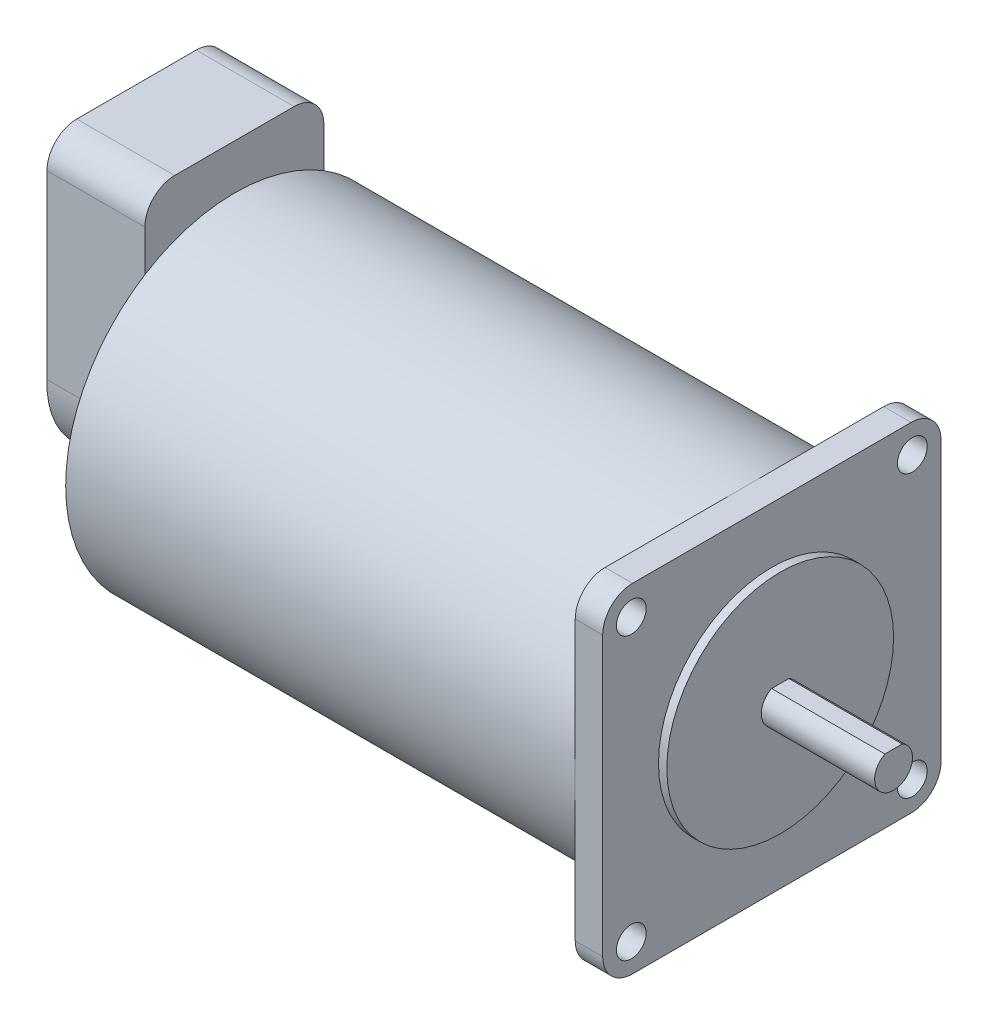
ISO-10303-21;
HEADER;
FILE_DESCRIPTION(('STEP AP214'),'2;1');
FILE_NAME('part.step','',(''),(''),'','','');
FILE_SCHEMA(('AUTOMOTIVE_DESIGN { 1 0 10303 214 1 1 1 1 }'));
ENDSEC;
DATA;
#1=APPLICATION_CONTEXT('core data for automotive mechanical design processes');
#2=APPLICATION_PROTOCOL_DEFINITION('international standard','automotive_design',2000,#1);
#3=PRODUCT_CONTEXT('',#1,'mechanical');
#4=PRODUCT('Part','Part','',(#3));
#5=PRODUCT_RELATED_PRODUCT_CATEGORY('part','',(#4));
#6=PRODUCT_DEFINITION_FORMATION('','',#4);
#7=PRODUCT_DEFINITION_CONTEXT('part definition',#1,'design');
#8=PRODUCT_DEFINITION('design','',#6,#7);
#9=PRODUCT_DEFINITION_SHAPE('','',#8);
#10=(LENGTH_UNIT() NAMED_UNIT(*) SI_UNIT(.MILLI.,.METRE.));
#11=(NAMED_UNIT(*) PLANE_ANGLE_UNIT() SI_UNIT($,.RADIAN.));
#12=(NAMED_UNIT(*) SI_UNIT($,.STERADIAN.) SOLID_ANGLE_UNIT());
#13=UNCERTAINTY_MEASURE_WITH_UNIT(LENGTH_MEASURE(1.E-05),#10,'distance_accuracy_value','');
#14=(GEOMETRIC_REPRESENTATION_CONTEXT(3) GLOBAL_UNCERTAINTY_ASSIGNED_CONTEXT((#13)) GLOBAL_UNIT_ASSIGNED_CONTEXT((#10,
#11,#12)) REPRESENTATION_CONTEXT('',''));
#15=CARTESIAN_POINT('',(0.,0.,0.));
#16=DIRECTION('',(0.,0.,1.));
#17=DIRECTION('',(1.,0.,0.));
#18=AXIS2_PLACEMENT_3D('',#15,#16,#17);
#19=CARTESIAN_POINT('',(0.,0.,0.));
#20=DIRECTION('',(1.,0.,0.));
#21=DIRECTION('',(0.,0.,-1.));
#22=AXIS2_PLACEMENT_3D('',#19,#20,#21);
#23=PLANE('',#22);
#24=DIRECTION('',(0.,-1.,0.));
#25=VECTOR('',#24,1.);
#26=CARTESIAN_POINT('',(0.,-2.26844785788964,-14.9198348553773));
#27=LINE('',#26,#25);
#28=CARTESIAN_POINT('',(0.,24.1064519970955,-14.9198348553773));
#29=VERTEX_POINT('',#28);
#30=CARTESIAN_POINT('',(0.,-2.26844785788964,-14.9198348553773));
#31=VERTEX_POINT('',#30);
#32=EDGE_CURVE('E11',#29,#31,#27,.T.);
#33=ORIENTED_EDGE('',*,*,#32,.F.);
#34=CARTESIAN_POINT('',(0.,0.,0.));
#35=DIRECTION('',(1.,0.,0.));
#36=DIRECTION('',(0.,0.,-1.));
#37=AXIS2_PLACEMENT_3D('',#34,#35,#36);
#38=CIRCLE('',#37,28.35);
#39=CARTESIAN_POINT('',(0.,24.0064807752179,15.0801651446227));
#40=VERTEX_POINT('',#39);
#41=EDGE_CURVE('E250',#40,#29,#38,.T.);
#42=ORIENTED_EDGE('',*,*,#41,.F.);
#43=DIRECTION('',(0.,1.,0.));
#44=VECTOR('',#43,1.);
#45=CARTESIAN_POINT('',(0.,0.579609356899091,15.0801651446227));
#46=LINE('',#45,#44);
#47=CARTESIAN_POINT('',(0.,0.579609356899091,15.0801651446227));
#48=VERTEX_POINT('',#47);
#49=EDGE_CURVE('E55',#48,#40,#46,.T.);
#50=ORIENTED_EDGE('',*,*,#49,.F.);
#51=CARTESIAN_POINT('',(0.,0.,0.));
#52=DIRECTION('',(-1.,0.,0.));
#53=DIRECTION('',(0.,0.,1.));
#54=AXIS2_PLACEMENT_3D('',#51,#52,#53);
#55=CIRCLE('',#54,15.0912997384485);
#56=EDGE_CURVE('E51',#31,#48,#55,.T.);
#57=ORIENTED_EDGE('',*,*,#56,.F.);
#58=EDGE_LOOP('',(#33,#42,#50,#57));
#59=FACE_BOUND('',#58,.T.);
#60=ADVANCED_FACE('F34',(#59),#23,.F.);
#61=CARTESIAN_POINT('',(91.4,0.,0.));
#62=DIRECTION('',(1.,0.,0.));
#63=DIRECTION('',(0.,0.,-1.));
#64=AXIS2_PLACEMENT_3D('',#61,#62,#63);
#65=PLANE('',#64);
#66=CARTESIAN_POINT('',(91.4,0.,0.));
#67=DIRECTION('',(1.,0.,0.));
#68=DIRECTION('',(0.,0.,-1.));
#69=AXIS2_PLACEMENT_3D('',#66,#67,#68);
#70=CIRCLE('',#69,19.);
#71=CARTESIAN_POINT('',(91.4,0.,-19.));
#72=VERTEX_POINT('',#71);
#73=EDGE_CURVE('E207',#72,#72,#70,.T.);
#74=ORIENTED_EDGE('',*,*,#73,.T.);
#75=EDGE_LOOP('',(#74));
#76=FACE_BOUND('',#75,.T.);
#77=DIRECTION('',(0.,0.,1.));
#78=VECTOR('',#77,1.);
#79=CARTESIAN_POINT('',(91.4,2.825,1.44913767461894));
#80=LINE('',#79,#78);
#81=CARTESIAN_POINT('',(91.4,2.825,-1.44913767461894));
#82=VERTEX_POINT('',#81);
#83=CARTESIAN_POINT('',(91.4,2.825,1.44913767461894));
#84=VERTEX_POINT('',#83);
#85=EDGE_CURVE('E188',#82,#84,#80,.T.);
#86=ORIENTED_EDGE('',*,*,#85,.F.);
#87=CARTESIAN_POINT('',(91.4,0.,0.));
#88=DIRECTION('',(1.,0.,0.));
#89=DIRECTION('',(0.,0.,1.));
#90=AXIS2_PLACEMENT_3D('',#87,#88,#89);
#91=CIRCLE('',#90,3.175);
#92=EDGE_CURVE('E186',#84,#82,#91,.T.);
#93=ORIENTED_EDGE('',*,*,#92,.F.);
#94=EDGE_LOOP('',(#86,#93));
#95=FACE_BOUND('',#94,.T.);
#96=ADVANCED_FACE('F374',(#76,#95),#65,.T.);
#97=CARTESIAN_POINT('',(85.4,0.,0.));
#98=DIRECTION('',(-1.,0.,0.));
#99=DIRECTION('',(0.,0.,1.));
#100=AXIS2_PLACEMENT_3D('',#97,#98,#99);
#101=CYLINDRICAL_SURFACE('',#100,28.35);
#102=CARTESIAN_POINT('',(85.4,0.,0.));
#103=DIRECTION('',(1.,0.,0.));
#104=DIRECTION('',(0.,0.,-1.));
#105=AXIS2_PLACEMENT_3D('',#102,#103,#104);
#106=CIRCLE('',#105,28.35);
#107=CARTESIAN_POINT('',(85.4,0.,-28.35));
#108=VERTEX_POINT('',#107);
#109=CARTESIAN_POINT('',(85.4,28.35,0.));
#110=VERTEX_POINT('',#109);
#111=EDGE_CURVE('E261',#108,#110,#106,.T.);
#112=ORIENTED_EDGE('',*,*,#111,.F.);
#113=CARTESIAN_POINT('',(85.4,-28.35,0.));
#114=VERTEX_POINT('',#113);
#115=EDGE_CURVE('E266',#114,#108,#106,.T.);
#116=ORIENTED_EDGE('',*,*,#115,.F.);
#117=CARTESIAN_POINT('',(85.4,0.,28.35));
#118=VERTEX_POINT('',#117);
#119=EDGE_CURVE('E329',#118,#114,#106,.T.);
#120=ORIENTED_EDGE('',*,*,#119,.F.);
#121=EDGE_CURVE('E265',#110,#118,#106,.T.);
#122=ORIENTED_EDGE('',*,*,#121,.F.);
#123=EDGE_LOOP('',(#112,#116,#120,#122));
#124=FACE_BOUND('',#123,.T.);
#125=EDGE_CURVE('E267',#29,#40,#38,.T.);
#126=ORIENTED_EDGE('',*,*,#125,.T.);
#127=ORIENTED_EDGE('',*,*,#41,.T.);
#128=EDGE_LOOP('',(#126,#127));
#129=FACE_BOUND('',#128,.T.);
#130=ADVANCED_FACE('F331',(#124,#129),#101,.T.);
#131=CARTESIAN_POINT('',(85.4,0.,0.));
#132=DIRECTION('',(1.,0.,0.));
#133=DIRECTION('',(0.,0.,-1.));
#134=AXIS2_PLACEMENT_3D('',#131,#132,#133);
#135=PLANE('',#134);
#136=CARTESIAN_POINT('',(85.4,23.55,-23.55));
#137=DIRECTION('',(1.,0.,0.));
#138=DIRECTION('',(0.,0.,-1.));
#139=AXIS2_PLACEMENT_3D('',#136,#137,#138);
#140=CIRCLE('',#139,2.5);
#141=CARTESIAN_POINT('',(85.4,23.55,-26.05));
#142=VERTEX_POINT('',#141);
#143=EDGE_CURVE('E222',#142,#142,#140,.T.);
#144=ORIENTED_EDGE('',*,*,#143,.T.);
#145=EDGE_LOOP('',(#144));
#146=FACE_BOUND('',#145,.T.);
#147=DIRECTION('',(0.,0.,1.));
#148=VECTOR('',#147,1.);
#149=CARTESIAN_POINT('',(85.4,28.35,28.35));
#150=LINE('',#149,#148);
#151=CARTESIAN_POINT('',(85.4,28.35,-23.35));
#152=VERTEX_POINT('',#151);
#153=EDGE_CURVE('E241',#152,#110,#150,.T.);
#154=ORIENTED_EDGE('',*,*,#153,.F.);
#155=CARTESIAN_POINT('',(85.4,23.35,-23.35));
#156=DIRECTION('',(1.,0.,0.));
#157=DIRECTION('',(0.,0.,-1.));
#158=AXIS2_PLACEMENT_3D('',#155,#156,#157);
#159=CIRCLE('',#158,5.);
#160=CARTESIAN_POINT('',(85.4,23.35,-28.35));
#161=VERTEX_POINT('',#160);
#162=EDGE_CURVE('E293',#152,#161,#159,.F.);
#163=ORIENTED_EDGE('',*,*,#162,.T.);
#164=DIRECTION('',(0.,1.,0.));
#165=VECTOR('',#164,1.);
#166=CARTESIAN_POINT('',(85.4,28.35,-28.35));
#167=LINE('',#166,#165);
#168=EDGE_CURVE('E256',#108,#161,#167,.T.);
#169=ORIENTED_EDGE('',*,*,#168,.F.);
#170=ORIENTED_EDGE('',*,*,#111,.T.);
#171=EDGE_LOOP('',(#154,#163,#169,#170));
#172=FACE_BOUND('',#171,.T.);
#173=ADVANCED_FACE('F359',(#146,#172),#135,.F.);
#174=CARTESIAN_POINT('',(85.4,23.55,23.55));
#175=DIRECTION('',(1.,0.,0.));
#176=DIRECTION('',(0.,0.,-1.));
#177=AXIS2_PLACEMENT_3D('',#174,#175,#176);
#178=CIRCLE('',#177,2.5);
#179=CARTESIAN_POINT('',(85.4,23.55,21.05));
#180=VERTEX_POINT('',#179);
#181=EDGE_CURVE('E228',#180,#180,#178,.T.);
#182=ORIENTED_EDGE('',*,*,#181,.T.);
#183=EDGE_LOOP('',(#182));
#184=FACE_BOUND('',#183,.T.);
#185=DIRECTION('',(0.,-1.,0.));
#186=VECTOR('',#185,1.);
#187=CARTESIAN_POINT('',(85.4,28.35,28.35));
#188=LINE('',#187,#186);
#189=CARTESIAN_POINT('',(85.4,23.35,28.35));
#190=VERTEX_POINT('',#189);
#191=EDGE_CURVE('E251',#190,#118,#188,.T.);
#192=ORIENTED_EDGE('',*,*,#191,.F.);
#193=CARTESIAN_POINT('',(85.4,23.35,23.35));
#194=DIRECTION('',(1.,0.,0.));
#195=DIRECTION('',(0.,0.,-1.));
#196=AXIS2_PLACEMENT_3D('',#193,#194,#195);
#197=CIRCLE('',#196,5.);
#198=CARTESIAN_POINT('',(85.4,28.35,23.35));
#199=VERTEX_POINT('',#198);
#200=EDGE_CURVE('E38',#190,#199,#197,.F.);
#201=ORIENTED_EDGE('',*,*,#200,.T.);
#202=EDGE_CURVE('E259',#110,#199,#150,.T.);
#203=ORIENTED_EDGE('',*,*,#202,.F.);
#204=ORIENTED_EDGE('',*,*,#121,.T.);
#205=EDGE_LOOP('',(#192,#201,#203,#204));
#206=FACE_BOUND('',#205,.T.);
#207=ADVANCED_FACE('F308',(#184,#206),#135,.F.);
#208=CARTESIAN_POINT('',(85.4,-23.55,23.55));
#209=DIRECTION('',(1.,0.,0.));
#210=DIRECTION('',(0.,0.,-1.));
#211=AXIS2_PLACEMENT_3D('',#208,#209,#210);
#212=CIRCLE('',#211,2.5);
#213=CARTESIAN_POINT('',(85.4,-23.55,21.05));
#214=VERTEX_POINT('',#213);
#215=EDGE_CURVE('E210',#214,#214,#212,.T.);
#216=ORIENTED_EDGE('',*,*,#215,.T.);
#217=EDGE_LOOP('',(#216));
#218=FACE_BOUND('',#217,.T.);
#219=DIRECTION('',(0.,0.,-1.));
#220=VECTOR('',#219,1.);
#221=CARTESIAN_POINT('',(85.4,-28.35,28.35));
#222=LINE('',#221,#220);
#223=CARTESIAN_POINT('',(85.4,-28.35,23.35));
#224=VERTEX_POINT('',#223);
#225=EDGE_CURVE('E254',#224,#114,#222,.T.);
#226=ORIENTED_EDGE('',*,*,#225,.F.);
#227=CARTESIAN_POINT('',(85.4,-23.35,23.35));
#228=DIRECTION('',(1.,0.,0.));
#229=DIRECTION('',(0.,0.,-1.));
#230=AXIS2_PLACEMENT_3D('',#227,#228,#229);
#231=CIRCLE('',#230,5.);
#232=CARTESIAN_POINT('',(85.4,-23.35,28.35));
#233=VERTEX_POINT('',#232);
#234=EDGE_CURVE('E295',#224,#233,#231,.F.);
#235=ORIENTED_EDGE('',*,*,#234,.T.);
#236=EDGE_CURVE('E234',#118,#233,#188,.T.);
#237=ORIENTED_EDGE('',*,*,#236,.F.);
#238=ORIENTED_EDGE('',*,*,#119,.T.);
#239=EDGE_LOOP('',(#226,#235,#237,#238));
#240=FACE_BOUND('',#239,.T.);
#241=ADVANCED_FACE('F337',(#218,#240),#135,.F.);
#242=CARTESIAN_POINT('',(85.4,-23.55,-23.55));
#243=DIRECTION('',(1.,0.,0.));
#244=DIRECTION('',(0.,0.,-1.));
#245=AXIS2_PLACEMENT_3D('',#242,#243,#244);
#246=CIRCLE('',#245,2.5);
#247=CARTESIAN_POINT('',(85.4,-23.55,-26.05));
#248=VERTEX_POINT('',#247);
#249=EDGE_CURVE('E216',#248,#248,#246,.T.);
#250=ORIENTED_EDGE('',*,*,#249,.T.);
#251=EDGE_LOOP('',(#250));
#252=FACE_BOUND('',#251,.T.);
#253=CARTESIAN_POINT('',(85.4,-23.35,-28.35));
#254=VERTEX_POINT('',#253);
#255=EDGE_CURVE('E257',#254,#108,#167,.T.);
#256=ORIENTED_EDGE('',*,*,#255,.F.);
#257=CARTESIAN_POINT('',(85.4,-23.35,-23.35));
#258=DIRECTION('',(1.,0.,0.));
#259=DIRECTION('',(0.,0.,-1.));
#260=AXIS2_PLACEMENT_3D('',#257,#258,#259);
#261=CIRCLE('',#260,5.);
#262=CARTESIAN_POINT('',(85.4,-28.35,-23.35));
#263=VERTEX_POINT('',#262);
#264=EDGE_CURVE('E273',#254,#263,#261,.F.);
#265=ORIENTED_EDGE('',*,*,#264,.T.);
#266=EDGE_CURVE('E253',#114,#263,#222,.T.);
#267=ORIENTED_EDGE('',*,*,#266,.F.);
#268=ORIENTED_EDGE('',*,*,#115,.T.);
#269=EDGE_LOOP('',(#256,#265,#267,#268));
#270=FACE_BOUND('',#269,.T.);
#271=ADVANCED_FACE('F356',(#252,#270),#135,.F.);
#272=CARTESIAN_POINT('',(90.,0.,0.));
#273=DIRECTION('',(1.,0.,0.));
#274=DIRECTION('',(0.,0.,-1.));
#275=AXIS2_PLACEMENT_3D('',#272,#273,#274);
#276=PLANE('',#275);
#277=CARTESIAN_POINT('',(90.,0.,0.));
#278=DIRECTION('',(1.,0.,0.));
#279=DIRECTION('',(0.,0.,-1.));
#280=AXIS2_PLACEMENT_3D('',#277,#278,#279);
#281=CIRCLE('',#280,19.);
#282=CARTESIAN_POINT('',(90.,0.,-19.));
#283=VERTEX_POINT('',#282);
#284=EDGE_CURVE('E206',#283,#283,#281,.T.);
#285=ORIENTED_EDGE('',*,*,#284,.F.);
#286=EDGE_LOOP('',(#285));
#287=FACE_BOUND('',#286,.T.);
#288=CARTESIAN_POINT('',(90.,-23.55,-23.55));
#289=DIRECTION('',(1.,0.,0.));
#290=DIRECTION('',(0.,0.,-1.));
#291=AXIS2_PLACEMENT_3D('',#288,#289,#290);
#292=CIRCLE('',#291,2.5);
#293=CARTESIAN_POINT('',(90.,-23.55,-26.05));
#294=VERTEX_POINT('',#293);
#295=EDGE_CURVE('E219',#294,#294,#292,.T.);
#296=ORIENTED_EDGE('',*,*,#295,.F.);
#297=EDGE_LOOP('',(#296));
#298=FACE_BOUND('',#297,.T.);
#299=CARTESIAN_POINT('',(90.,23.55,23.55));
#300=DIRECTION('',(1.,0.,0.));
#301=DIRECTION('',(0.,0.,-1.));
#302=AXIS2_PLACEMENT_3D('',#299,#300,#301);
#303=CIRCLE('',#302,2.5);
#304=CARTESIAN_POINT('',(90.,23.55,21.05));
#305=VERTEX_POINT('',#304);
#306=EDGE_CURVE('E231',#305,#305,#303,.T.);
#307=ORIENTED_EDGE('',*,*,#306,.F.);
#308=EDGE_LOOP('',(#307));
#309=FACE_BOUND('',#308,.T.);
#310=DIRECTION('',(0.,0.,-1.));
#311=VECTOR('',#310,1.);
#312=CARTESIAN_POINT('',(90.,-28.35,28.35));
#313=LINE('',#312,#311);
#314=CARTESIAN_POINT('',(90.,-28.35,23.35));
#315=VERTEX_POINT('',#314);
#316=CARTESIAN_POINT('',(90.,-28.35,-23.35));
#317=VERTEX_POINT('',#316);
#318=EDGE_CURVE('E240',#315,#317,#313,.T.);
#319=ORIENTED_EDGE('',*,*,#318,.T.);
#320=CARTESIAN_POINT('',(90.,-23.35,-23.35));
#321=DIRECTION('',(1.,0.,0.));
#322=DIRECTION('',(0.,0.,-1.));
#323=AXIS2_PLACEMENT_3D('',#320,#321,#322);
#324=CIRCLE('',#323,5.);
#325=CARTESIAN_POINT('',(90.,-23.35,-28.35));
#326=VERTEX_POINT('',#325);
#327=EDGE_CURVE('E286',#317,#326,#324,.T.);
#328=ORIENTED_EDGE('',*,*,#327,.T.);
#329=DIRECTION('',(0.,1.,0.));
#330=VECTOR('',#329,1.);
#331=CARTESIAN_POINT('',(90.,28.35,-28.35));
#332=LINE('',#331,#330);
#333=CARTESIAN_POINT('',(90.,23.35,-28.35));
#334=VERTEX_POINT('',#333);
#335=EDGE_CURVE('E244',#326,#334,#332,.T.);
#336=ORIENTED_EDGE('',*,*,#335,.T.);
#337=CARTESIAN_POINT('',(90.,23.35,-23.35));
#338=DIRECTION('',(1.,0.,0.));
#339=DIRECTION('',(0.,0.,-1.));
#340=AXIS2_PLACEMENT_3D('',#337,#338,#339);
#341=CIRCLE('',#340,5.);
#342=CARTESIAN_POINT('',(90.,28.35,-23.35));
#343=VERTEX_POINT('',#342);
#344=EDGE_CURVE('E284',#334,#343,#341,.T.);
#345=ORIENTED_EDGE('',*,*,#344,.T.);
#346=DIRECTION('',(0.,0.,1.));
#347=VECTOR('',#346,1.);
#348=CARTESIAN_POINT('',(90.,28.35,28.35));
#349=LINE('',#348,#347);
#350=CARTESIAN_POINT('',(90.,28.35,23.35));
#351=VERTEX_POINT('',#350);
#352=EDGE_CURVE('E247',#343,#351,#349,.T.);
#353=ORIENTED_EDGE('',*,*,#352,.T.);
#354=CARTESIAN_POINT('',(90.,23.35,23.35));
#355=DIRECTION('',(1.,0.,0.));
#356=DIRECTION('',(0.,0.,-1.));
#357=AXIS2_PLACEMENT_3D('',#354,#355,#356);
#358=CIRCLE('',#357,5.);
#359=CARTESIAN_POINT('',(90.,23.35,28.35));
#360=VERTEX_POINT('',#359);
#361=EDGE_CURVE('E280',#351,#360,#358,.T.);
#362=ORIENTED_EDGE('',*,*,#361,.T.);
#363=DIRECTION('',(0.,-1.,0.));
#364=VECTOR('',#363,1.);
#365=CARTESIAN_POINT('',(90.,28.35,28.35));
#366=LINE('',#365,#364);
#367=CARTESIAN_POINT('',(90.,-23.35,28.35));
#368=VERTEX_POINT('',#367);
#369=EDGE_CURVE('E237',#360,#368,#366,.T.);
#370=ORIENTED_EDGE('',*,*,#369,.T.);
#371=CARTESIAN_POINT('',(90.,-23.35,23.35));
#372=DIRECTION('',(1.,0.,0.));
#373=DIRECTION('',(0.,0.,-1.));
#374=AXIS2_PLACEMENT_3D('',#371,#372,#373);
#375=CIRCLE('',#374,5.);
#376=EDGE_CURVE('E282',#368,#315,#375,.T.);
#377=ORIENTED_EDGE('',*,*,#376,.T.);
#378=EDGE_LOOP('',(#319,#328,#336,#345,#353,#362,#370,#377));
#379=FACE_BOUND('',#378,.T.);
#380=CARTESIAN_POINT('',(90.,23.55,-23.55));
#381=DIRECTION('',(1.,0.,0.));
#382=DIRECTION('',(0.,0.,-1.));
#383=AXIS2_PLACEMENT_3D('',#380,#381,#382);
#384=CIRCLE('',#383,2.5);
#385=CARTESIAN_POINT('',(90.,23.55,-26.05));
#386=VERTEX_POINT('',#385);
#387=EDGE_CURVE('E225',#386,#386,#384,.T.);
#388=ORIENTED_EDGE('',*,*,#387,.F.);
#389=EDGE_LOOP('',(#388));
#390=FACE_BOUND('',#389,.T.);
#391=CARTESIAN_POINT('',(90.,-23.55,23.55));
#392=DIRECTION('',(1.,0.,0.));
#393=DIRECTION('',(0.,0.,-1.));
#394=AXIS2_PLACEMENT_3D('',#391,#392,#393);
#395=CIRCLE('',#394,2.5);
#396=CARTESIAN_POINT('',(90.,-23.55,21.05));
#397=VERTEX_POINT('',#396);
#398=EDGE_CURVE('E213',#397,#397,#395,.T.);
#399=ORIENTED_EDGE('',*,*,#398,.F.);
#400=EDGE_LOOP('',(#399));
#401=FACE_BOUND('',#400,.T.);
#402=ADVANCED_FACE('F320',(#287,#298,#309,#379,#390,#401),#276,.T.);
#403=CARTESIAN_POINT('',(90.,28.35,28.35));
#404=DIRECTION('',(0.,0.,-1.));
#405=DIRECTION('',(-1.,0.,0.));
#406=AXIS2_PLACEMENT_3D('',#403,#404,#405);
#407=PLANE('',#406);
#408=ORIENTED_EDGE('',*,*,#236,.T.);
#409=DIRECTION('',(-1.,0.,0.));
#410=VECTOR('',#409,1.);
#411=CARTESIAN_POINT('',(90.,-23.35,28.35));
#412=LINE('',#411,#410);
#413=EDGE_CURVE('E299',#233,#368,#412,.F.);
#414=ORIENTED_EDGE('',*,*,#413,.T.);
#415=ORIENTED_EDGE('',*,*,#369,.F.);
#416=DIRECTION('',(-1.,0.,0.));
#417=VECTOR('',#416,1.);
#418=CARTESIAN_POINT('',(90.,23.35,28.35));
#419=LINE('',#418,#417);
#420=EDGE_CURVE('E297',#360,#190,#419,.T.);
#421=ORIENTED_EDGE('',*,*,#420,.T.);
#422=ORIENTED_EDGE('',*,*,#191,.T.);
#423=EDGE_LOOP('',(#408,#414,#415,#421,#422));
#424=FACE_BOUND('',#423,.T.);
#425=ADVANCED_FACE('F323',(#424),#407,.F.);
#426=CARTESIAN_POINT('',(90.,-28.35,28.35));
#427=DIRECTION('',(0.,1.,0.));
#428=DIRECTION('',(0.,0.,1.));
#429=AXIS2_PLACEMENT_3D('',#426,#427,#428);
#430=PLANE('',#429);
#431=ORIENTED_EDGE('',*,*,#266,.T.);
#432=DIRECTION('',(-1.,0.,0.));
#433=VECTOR('',#432,1.);
#434=CARTESIAN_POINT('',(90.,-28.35,-23.35));
#435=LINE('',#434,#433);
#436=EDGE_CURVE('E278',#263,#317,#435,.F.);
#437=ORIENTED_EDGE('',*,*,#436,.T.);
#438=ORIENTED_EDGE('',*,*,#318,.F.);
#439=DIRECTION('',(-1.,0.,0.));
#440=VECTOR('',#439,1.);
#441=CARTESIAN_POINT('',(90.,-28.35,23.35));
#442=LINE('',#441,#440);
#443=EDGE_CURVE('E275',#315,#224,#442,.T.);
#444=ORIENTED_EDGE('',*,*,#443,.T.);
#445=ORIENTED_EDGE('',*,*,#225,.T.);
#446=EDGE_LOOP('',(#431,#437,#438,#444,#445));
#447=FACE_BOUND('',#446,.T.);
#448=ADVANCED_FACE('F344',(#447),#430,.F.);
#449=CARTESIAN_POINT('',(90.,28.35,-28.35));
#450=DIRECTION('',(0.,0.,1.));
#451=DIRECTION('',(0.,-1.,0.));
#452=AXIS2_PLACEMENT_3D('',#449,#450,#451);
#453=PLANE('',#452);
#454=ORIENTED_EDGE('',*,*,#335,.F.);
#455=DIRECTION('',(-1.,0.,0.));
#456=VECTOR('',#455,1.);
#457=CARTESIAN_POINT('',(90.,-23.35,-28.35));
#458=LINE('',#457,#456);
#459=EDGE_CURVE('E270',#326,#254,#458,.T.);
#460=ORIENTED_EDGE('',*,*,#459,.T.);
#461=ORIENTED_EDGE('',*,*,#255,.T.);
#462=ORIENTED_EDGE('',*,*,#168,.T.);
#463=DIRECTION('',(-1.,0.,0.));
#464=VECTOR('',#463,1.);
#465=CARTESIAN_POINT('',(90.,23.35,-28.35));
#466=LINE('',#465,#464);
#467=EDGE_CURVE('E264',#161,#334,#466,.F.);
#468=ORIENTED_EDGE('',*,*,#467,.T.);
#469=EDGE_LOOP('',(#454,#460,#461,#462,#468));
#470=FACE_BOUND('',#469,.T.);
#471=ADVANCED_FACE('F353',(#470),#453,.F.);
#472=CARTESIAN_POINT('',(90.,28.35,28.35));
#473=DIRECTION('',(0.,-1.,0.));
#474=DIRECTION('',(0.,0.,-1.));
#475=AXIS2_PLACEMENT_3D('',#472,#473,#474);
#476=PLANE('',#475);
#477=ORIENTED_EDGE('',*,*,#352,.F.);
#478=DIRECTION('',(-1.,0.,0.));
#479=VECTOR('',#478,1.);
#480=CARTESIAN_POINT('',(90.,28.35,-23.35));
#481=LINE('',#480,#479);
#482=EDGE_CURVE('E290',#343,#152,#481,.T.);
#483=ORIENTED_EDGE('',*,*,#482,.T.);
#484=ORIENTED_EDGE('',*,*,#153,.T.);
#485=ORIENTED_EDGE('',*,*,#202,.T.);
#486=DIRECTION('',(-1.,0.,0.));
#487=VECTOR('',#486,1.);
#488=CARTESIAN_POINT('',(90.,28.35,23.35));
#489=LINE('',#488,#487);
#490=EDGE_CURVE('E288',#199,#351,#489,.F.);
#491=ORIENTED_EDGE('',*,*,#490,.T.);
#492=EDGE_LOOP('',(#477,#483,#484,#485,#491));
#493=FACE_BOUND('',#492,.T.);
#494=ADVANCED_FACE('F315',(#493),#476,.F.);
#495=CARTESIAN_POINT('',(90.,23.55,23.55));
#496=DIRECTION('',(-1.,0.,0.));
#497=DIRECTION('',(0.,0.,1.));
#498=AXIS2_PLACEMENT_3D('',#495,#496,#497);
#499=CYLINDRICAL_SURFACE('',#498,2.5);
#500=ORIENTED_EDGE('',*,*,#306,.T.);
#501=EDGE_LOOP('',(#500));
#502=FACE_BOUND('',#501,.T.);
#503=ORIENTED_EDGE('',*,*,#181,.F.);
#504=EDGE_LOOP('',(#503));
#505=FACE_BOUND('',#504,.T.);
#506=ADVANCED_FACE('F419',(#502,#505),#499,.F.);
#507=CARTESIAN_POINT('',(90.,23.55,-23.55));
#508=DIRECTION('',(-1.,0.,0.));
#509=DIRECTION('',(0.,0.,1.));
#510=AXIS2_PLACEMENT_3D('',#507,#508,#509);
#511=CYLINDRICAL_SURFACE('',#510,2.5);
#512=ORIENTED_EDGE('',*,*,#387,.T.);
#513=EDGE_LOOP('',(#512));
#514=FACE_BOUND('',#513,.T.);
#515=ORIENTED_EDGE('',*,*,#143,.F.);
#516=EDGE_LOOP('',(#515));
#517=FACE_BOUND('',#516,.T.);
#518=ADVANCED_FACE('F409',(#514,#517),#511,.F.);
#519=CARTESIAN_POINT('',(90.,-23.55,-23.55));
#520=DIRECTION('',(-1.,0.,0.));
#521=DIRECTION('',(0.,0.,1.));
#522=AXIS2_PLACEMENT_3D('',#519,#520,#521);
#523=CYLINDRICAL_SURFACE('',#522,2.5);
#524=ORIENTED_EDGE('',*,*,#295,.T.);
#525=EDGE_LOOP('',(#524));
#526=FACE_BOUND('',#525,.T.);
#527=ORIENTED_EDGE('',*,*,#249,.F.);
#528=EDGE_LOOP('',(#527));
#529=FACE_BOUND('',#528,.T.);
#530=ADVANCED_FACE('F406',(#526,#529),#523,.F.);
#531=CARTESIAN_POINT('',(90.,-23.55,23.55));
#532=DIRECTION('',(-1.,0.,0.));
#533=DIRECTION('',(0.,0.,1.));
#534=AXIS2_PLACEMENT_3D('',#531,#532,#533);
#535=CYLINDRICAL_SURFACE('',#534,2.5);
#536=ORIENTED_EDGE('',*,*,#398,.T.);
#537=EDGE_LOOP('',(#536));
#538=FACE_BOUND('',#537,.T.);
#539=ORIENTED_EDGE('',*,*,#215,.F.);
#540=EDGE_LOOP('',(#539));
#541=FACE_BOUND('',#540,.T.);
#542=ADVANCED_FACE('F408',(#538,#541),#535,.F.);
#543=CARTESIAN_POINT('',(91.4,0.,0.));
#544=DIRECTION('',(-1.,0.,0.));
#545=DIRECTION('',(0.,0.,1.));
#546=AXIS2_PLACEMENT_3D('',#543,#544,#545);
#547=CYLINDRICAL_SURFACE('',#546,19.);
#548=ORIENTED_EDGE('',*,*,#73,.F.);
#549=EDGE_LOOP('',(#548));
#550=FACE_BOUND('',#549,.T.);
#551=ORIENTED_EDGE('',*,*,#284,.T.);
#552=EDGE_LOOP('',(#551));
#553=FACE_BOUND('',#552,.T.);
#554=ADVANCED_FACE('F416',(#550,#553),#547,.T.);
#555=CARTESIAN_POINT('',(110.4,0.,0.));
#556=DIRECTION('',(-1.,0.,0.));
#557=DIRECTION('',(0.,0.,1.));
#558=AXIS2_PLACEMENT_3D('',#555,#556,#557);
#559=CYLINDRICAL_SURFACE('',#558,3.175);
#560=ORIENTED_EDGE('',*,*,#92,.T.);
#561=DIRECTION('',(-1.,0.,0.));
#562=VECTOR('',#561,1.);
#563=CARTESIAN_POINT('',(110.4,2.825,-1.44913767461894));
#564=LINE('',#563,#562);
#565=CARTESIAN_POINT('',(110.4,2.825,-1.44913767461894));
#566=VERTEX_POINT('',#565);
#567=EDGE_CURVE('E203',#566,#82,#564,.T.);
#568=ORIENTED_EDGE('',*,*,#567,.F.);
#569=CARTESIAN_POINT('',(110.4,0.,0.));
#570=DIRECTION('',(1.,0.,0.));
#571=DIRECTION('',(0.,0.,1.));
#572=AXIS2_PLACEMENT_3D('',#569,#570,#571);
#573=CIRCLE('',#572,3.175);
#574=CARTESIAN_POINT('',(110.4,2.825,1.44913767461894));
#575=VERTEX_POINT('',#574);
#576=EDGE_CURVE('E194',#575,#566,#573,.T.);
#577=ORIENTED_EDGE('',*,*,#576,.F.);
#578=DIRECTION('',(-1.,0.,0.));
#579=VECTOR('',#578,1.);
#580=CARTESIAN_POINT('',(110.4,2.825,1.44913767461894));
#581=LINE('',#580,#579);
#582=EDGE_CURVE('E198',#575,#84,#581,.T.);
#583=ORIENTED_EDGE('',*,*,#582,.T.);
#584=EDGE_LOOP('',(#560,#568,#577,#583));
#585=FACE_BOUND('',#584,.T.);
#586=ADVANCED_FACE('F488',(#585),#559,.T.);
#587=CARTESIAN_POINT('',(110.4,2.825,1.44913767461894));
#588=DIRECTION('',(0.,-1.,0.));
#589=DIRECTION('',(0.,0.,-1.));
#590=AXIS2_PLACEMENT_3D('',#587,#588,#589);
#591=PLANE('',#590);
#592=ORIENTED_EDGE('',*,*,#85,.T.);
#593=ORIENTED_EDGE('',*,*,#582,.F.);
#594=DIRECTION('',(0.,0.,1.));
#595=VECTOR('',#594,1.);
#596=CARTESIAN_POINT('',(110.4,2.825,1.44913767461894));
#597=LINE('',#596,#595);
#598=EDGE_CURVE('E197',#566,#575,#597,.T.);
#599=ORIENTED_EDGE('',*,*,#598,.F.);
#600=ORIENTED_EDGE('',*,*,#567,.T.);
#601=EDGE_LOOP('',(#592,#593,#599,#600));
#602=FACE_BOUND('',#601,.T.);
#603=ADVANCED_FACE('F477',(#602),#591,.F.);
#604=CARTESIAN_POINT('',(110.4,0.,0.));
#605=DIRECTION('',(-1.,0.,0.));
#606=DIRECTION('',(0.,0.,1.));
#607=AXIS2_PLACEMENT_3D('',#604,#605,#606);
#608=PLANE('',#607);
#609=ORIENTED_EDGE('',*,*,#576,.T.);
#610=ORIENTED_EDGE('',*,*,#598,.T.);
#611=EDGE_LOOP('',(#609,#610));
#612=FACE_BOUND('',#611,.T.);
#613=ADVANCED_FACE('F371',(#612),#608,.F.);
#614=CARTESIAN_POINT('',(90.,-23.35,-23.35));
#615=DIRECTION('',(-1.,0.,0.));
#616=DIRECTION('',(0.,0.,1.));
#617=AXIS2_PLACEMENT_3D('',#614,#615,#616);
#618=CYLINDRICAL_SURFACE('',#617,5.);
#619=ORIENTED_EDGE('',*,*,#327,.F.);
#620=ORIENTED_EDGE('',*,*,#436,.F.);
#621=ORIENTED_EDGE('',*,*,#264,.F.);
#622=ORIENTED_EDGE('',*,*,#459,.F.);
#623=EDGE_LOOP('',(#619,#620,#621,#622));
#624=FACE_BOUND('',#623,.T.);
#625=ADVANCED_FACE('F350',(#624),#618,.T.);
#626=CARTESIAN_POINT('',(90.,23.35,-23.35));
#627=DIRECTION('',(-1.,0.,0.));
#628=DIRECTION('',(0.,0.,1.));
#629=AXIS2_PLACEMENT_3D('',#626,#627,#628);
#630=CYLINDRICAL_SURFACE('',#629,5.);
#631=ORIENTED_EDGE('',*,*,#344,.F.);
#632=ORIENTED_EDGE('',*,*,#467,.F.);
#633=ORIENTED_EDGE('',*,*,#162,.F.);
#634=ORIENTED_EDGE('',*,*,#482,.F.);
#635=EDGE_LOOP('',(#631,#632,#633,#634));
#636=FACE_BOUND('',#635,.T.);
#637=ADVANCED_FACE('F363',(#636),#630,.T.);
#638=CARTESIAN_POINT('',(90.,-23.35,23.35));
#639=DIRECTION('',(-1.,0.,0.));
#640=DIRECTION('',(0.,0.,1.));
#641=AXIS2_PLACEMENT_3D('',#638,#639,#640);
#642=CYLINDRICAL_SURFACE('',#641,5.);
#643=ORIENTED_EDGE('',*,*,#376,.F.);
#644=ORIENTED_EDGE('',*,*,#413,.F.);
#645=ORIENTED_EDGE('',*,*,#234,.F.);
#646=ORIENTED_EDGE('',*,*,#443,.F.);
#647=EDGE_LOOP('',(#643,#644,#645,#646));
#648=FACE_BOUND('',#647,.T.);
#649=ADVANCED_FACE('F340',(#648),#642,.T.);
#650=CARTESIAN_POINT('',(90.,23.35,23.35));
#651=DIRECTION('',(-1.,0.,0.));
#652=DIRECTION('',(0.,0.,1.));
#653=AXIS2_PLACEMENT_3D('',#650,#651,#652);
#654=CYLINDRICAL_SURFACE('',#653,5.);
#655=ORIENTED_EDGE('',*,*,#361,.F.);
#656=ORIENTED_EDGE('',*,*,#490,.F.);
#657=ORIENTED_EDGE('',*,*,#200,.F.);
#658=ORIENTED_EDGE('',*,*,#420,.F.);
#659=EDGE_LOOP('',(#655,#656,#657,#658));
#660=FACE_BOUND('',#659,.T.);
#661=ADVANCED_FACE('F36',(#660),#654,.T.);
#662=CARTESIAN_POINT('',(-16.4,0.,0.));
#663=DIRECTION('',(1.,0.,0.));
#664=DIRECTION('',(0.,0.,-1.));
#665=AXIS2_PLACEMENT_3D('',#662,#663,#664);
#666=CYLINDRICAL_SURFACE('',#665,15.0912997384485);
#667=ORIENTED_EDGE('',*,*,#56,.T.);
#668=DIRECTION('',(1.,0.,0.));
#669=VECTOR('',#668,1.);
#670=CARTESIAN_POINT('',(-16.4,0.579609356899091,15.0801651446227));
#671=LINE('',#670,#669);
#672=CARTESIAN_POINT('',(-16.4,0.579609356899091,15.0801651446227));
#673=VERTEX_POINT('',#672);
#674=EDGE_CURVE('E169',#673,#48,#671,.T.);
#675=ORIENTED_EDGE('',*,*,#674,.F.);
#676=CARTESIAN_POINT('',(-16.4,0.,0.));
#677=DIRECTION('',(-1.,0.,0.));
#678=DIRECTION('',(0.,0.,1.));
#679=AXIS2_PLACEMENT_3D('',#676,#677,#678);
#680=CIRCLE('',#679,15.0912997384485);
#681=CARTESIAN_POINT('',(-16.4,-2.26844785788964,-14.9198348553773));
#682=VERTEX_POINT('',#681);
#683=EDGE_CURVE('E175',#682,#673,#680,.T.);
#684=ORIENTED_EDGE('',*,*,#683,.F.);
#685=DIRECTION('',(1.,0.,0.));
#686=VECTOR('',#685,1.);
#687=CARTESIAN_POINT('',(-16.4,-2.26844785788964,-14.9198348553773));
#688=LINE('',#687,#686);
#689=EDGE_CURVE('E671',#682,#31,#688,.T.);
#690=ORIENTED_EDGE('',*,*,#689,.T.);
#691=EDGE_LOOP('',(#667,#675,#684,#690));
#692=FACE_BOUND('',#691,.T.);
#693=ADVANCED_FACE('F185',(#692),#666,.T.);
#694=CARTESIAN_POINT('',(-16.4,0.579609356899091,15.0801651446227));
#695=DIRECTION('',(0.,0.,-1.));
#696=DIRECTION('',(0.,1.,0.));
#697=AXIS2_PLACEMENT_3D('',#694,#695,#696);
#698=PLANE('',#697);
#699=ORIENTED_EDGE('',*,*,#49,.T.);
#700=CARTESIAN_POINT('',(0.,30.9087002615514,15.0801651446227));
#701=VERTEX_POINT('',#700);
#702=EDGE_CURVE('E661',#40,#701,#46,.T.);
#703=ORIENTED_EDGE('',*,*,#702,.T.);
#704=DIRECTION('',(1.,0.,0.));
#705=VECTOR('',#704,1.);
#706=CARTESIAN_POINT('',(-16.4,30.9087002615514,15.0801651446227));
#707=LINE('',#706,#705);
#708=CARTESIAN_POINT('',(-16.4,30.9087002615514,15.0801651446227));
#709=VERTEX_POINT('',#708);
#710=EDGE_CURVE('E171',#709,#701,#707,.T.);
#711=ORIENTED_EDGE('',*,*,#710,.F.);
#712=DIRECTION('',(0.,1.,0.));
#713=VECTOR('',#712,1.);
#714=CARTESIAN_POINT('',(-16.4,0.579609356899091,15.0801651446227));
#715=LINE('',#714,#713);
#716=EDGE_CURVE('E165',#673,#709,#715,.T.);
#717=ORIENTED_EDGE('',*,*,#716,.F.);
#718=ORIENTED_EDGE('',*,*,#674,.T.);
#719=EDGE_LOOP('',(#699,#703,#711,#717,#718));
#720=FACE_BOUND('',#719,.T.);
#721=ADVANCED_FACE('F167',(#720),#698,.F.);
#722=CARTESIAN_POINT('',(-16.4,30.9087002615515,10.0801651446227));
#723=DIRECTION('',(1.,0.,0.));
#724=DIRECTION('',(0.,0.,-1.));
#725=AXIS2_PLACEMENT_3D('',#722,#723,#724);
#726=CYLINDRICAL_SURFACE('',#725,5.);
#727=CARTESIAN_POINT('',(0.,30.9087002615515,10.0801651446227));
#728=DIRECTION('',(-1.,0.,0.));
#729=DIRECTION('',(0.,0.,-1.));
#730=AXIS2_PLACEMENT_3D('',#727,#728,#729);
#731=CIRCLE('',#730,5.);
#732=CARTESIAN_POINT('',(0.,35.9087002615515,10.0801651446226));
#733=VERTEX_POINT('',#732);
#734=EDGE_CURVE('E682',#701,#733,#731,.T.);
#735=ORIENTED_EDGE('',*,*,#734,.T.);
#736=DIRECTION('',(1.,0.,0.));
#737=VECTOR('',#736,1.);
#738=CARTESIAN_POINT('',(-16.4,35.9087002615515,10.0801651446226));
#739=LINE('',#738,#737);
#740=CARTESIAN_POINT('',(-16.4,35.9087002615515,10.0801651446226));
#741=VERTEX_POINT('',#740);
#742=EDGE_CURVE('E190',#741,#733,#739,.T.);
#743=ORIENTED_EDGE('',*,*,#742,.F.);
#744=CARTESIAN_POINT('',(-16.4,30.9087002615515,10.0801651446227));
#745=DIRECTION('',(-1.,0.,0.));
#746=DIRECTION('',(0.,0.,-1.));
#747=AXIS2_PLACEMENT_3D('',#744,#745,#746);
#748=CIRCLE('',#747,5.);
#749=EDGE_CURVE('E174',#709,#741,#748,.T.);
#750=ORIENTED_EDGE('',*,*,#749,.F.);
#751=ORIENTED_EDGE('',*,*,#710,.T.);
#752=EDGE_LOOP('',(#735,#743,#750,#751));
#753=FACE_BOUND('',#752,.T.);
#754=ADVANCED_FACE('F594',(#753),#726,.T.);
#755=CARTESIAN_POINT('',(-16.4,35.9087002615515,-9.91983485537731));
#756=DIRECTION('',(0.,-1.,0.));
#757=DIRECTION('',(0.,0.,-1.));
#758=AXIS2_PLACEMENT_3D('',#755,#756,#757);
#759=PLANE('',#758);
#760=DIRECTION('',(0.,0.,-1.));
#761=VECTOR('',#760,1.);
#762=CARTESIAN_POINT('',(0.,35.9087002615515,-9.91983485537731));
#763=LINE('',#762,#761);
#764=CARTESIAN_POINT('',(0.,35.9087002615515,-9.91983485537731));
#765=VERTEX_POINT('',#764);
#766=EDGE_CURVE('E667',#733,#765,#763,.T.);
#767=ORIENTED_EDGE('',*,*,#766,.T.);
#768=DIRECTION('',(1.,0.,0.));
#769=VECTOR('',#768,1.);
#770=CARTESIAN_POINT('',(-16.4,35.9087002615515,-9.91983485537731));
#771=LINE('',#770,#769);
#772=CARTESIAN_POINT('',(-16.4,35.9087002615515,-9.91983485537731));
#773=VERTEX_POINT('',#772);
#774=EDGE_CURVE('E674',#773,#765,#771,.T.);
#775=ORIENTED_EDGE('',*,*,#774,.F.);
#776=DIRECTION('',(0.,0.,-1.));
#777=VECTOR('',#776,1.);
#778=CARTESIAN_POINT('',(-16.4,35.9087002615515,-9.91983485537731));
#779=LINE('',#778,#777);
#780=EDGE_CURVE('E681',#741,#773,#779,.T.);
#781=ORIENTED_EDGE('',*,*,#780,.F.);
#782=ORIENTED_EDGE('',*,*,#742,.T.);
#783=EDGE_LOOP('',(#767,#775,#781,#782));
#784=FACE_BOUND('',#783,.T.);
#785=ADVANCED_FACE('F603',(#784),#759,.F.);
#786=CARTESIAN_POINT('',(-16.4,30.9087002615515,-9.91983485537735));
#787=DIRECTION('',(1.,0.,0.));
#788=DIRECTION('',(0.,0.,-1.));
#789=AXIS2_PLACEMENT_3D('',#786,#787,#788);
#790=CYLINDRICAL_SURFACE('',#789,5.);
#791=CARTESIAN_POINT('',(0.,30.9087002615515,-9.91983485537735));
#792=DIRECTION('',(-1.,0.,0.));
#793=DIRECTION('',(0.,0.,-1.));
#794=AXIS2_PLACEMENT_3D('',#791,#792,#793);
#795=CIRCLE('',#794,5.);
#796=CARTESIAN_POINT('',(0.,30.9087002615514,-14.9198348553773));
#797=VERTEX_POINT('',#796);
#798=EDGE_CURVE('E666',#765,#797,#795,.T.);
#799=ORIENTED_EDGE('',*,*,#798,.T.);
#800=DIRECTION('',(1.,0.,0.));
#801=VECTOR('',#800,1.);
#802=CARTESIAN_POINT('',(-16.4,30.9087002615514,-14.9198348553773));
#803=LINE('',#802,#801);
#804=CARTESIAN_POINT('',(-16.4,30.9087002615514,-14.9198348553773));
#805=VERTEX_POINT('',#804);
#806=EDGE_CURVE('E665',#805,#797,#803,.T.);
#807=ORIENTED_EDGE('',*,*,#806,.F.);
#808=CARTESIAN_POINT('',(-16.4,30.9087002615515,-9.91983485537735));
#809=DIRECTION('',(-1.,0.,0.));
#810=DIRECTION('',(0.,0.,-1.));
#811=AXIS2_PLACEMENT_3D('',#808,#809,#810);
#812=CIRCLE('',#811,5.);
#813=EDGE_CURVE('E688',#773,#805,#812,.T.);
#814=ORIENTED_EDGE('',*,*,#813,.F.);
#815=ORIENTED_EDGE('',*,*,#774,.T.);
#816=EDGE_LOOP('',(#799,#807,#814,#815));
#817=FACE_BOUND('',#816,.T.);
#818=ADVANCED_FACE('F613',(#817),#790,.T.);
#819=CARTESIAN_POINT('',(-16.4,-2.26844785788964,-14.9198348553773));
#820=DIRECTION('',(0.,0.,1.));
#821=DIRECTION('',(1.,0.,0.));
#822=AXIS2_PLACEMENT_3D('',#819,#820,#821);
#823=PLANE('',#822);
#824=EDGE_CURVE('E44',#797,#29,#27,.T.);
#825=ORIENTED_EDGE('',*,*,#824,.T.);
#826=ORIENTED_EDGE('',*,*,#32,.T.);
#827=ORIENTED_EDGE('',*,*,#689,.F.);
#828=DIRECTION('',(0.,-1.,0.));
#829=VECTOR('',#828,1.);
#830=CARTESIAN_POINT('',(-16.4,-2.26844785788964,-14.9198348553773));
#831=LINE('',#830,#829);
#832=EDGE_CURVE('E180',#805,#682,#831,.T.);
#833=ORIENTED_EDGE('',*,*,#832,.F.);
#834=ORIENTED_EDGE('',*,*,#806,.T.);
#835=EDGE_LOOP('',(#825,#826,#827,#833,#834));
#836=FACE_BOUND('',#835,.T.);
#837=ADVANCED_FACE('F623',(#836),#823,.F.);
#838=CARTESIAN_POINT('',(-16.4,0.,0.));
#839=DIRECTION('',(-1.,0.,0.));
#840=DIRECTION('',(0.,0.,1.));
#841=AXIS2_PLACEMENT_3D('',#838,#839,#840);
#842=PLANE('',#841);
#843=ORIENTED_EDGE('',*,*,#683,.T.);
#844=ORIENTED_EDGE('',*,*,#716,.T.);
#845=ORIENTED_EDGE('',*,*,#749,.T.);
#846=ORIENTED_EDGE('',*,*,#780,.T.);
#847=ORIENTED_EDGE('',*,*,#813,.T.);
#848=ORIENTED_EDGE('',*,*,#832,.T.);
#849=EDGE_LOOP('',(#843,#844,#845,#846,#847,#848));
#850=FACE_BOUND('',#849,.T.);
#851=ADVANCED_FACE('F178',(#850),#842,.T.);
#852=CARTESIAN_POINT('',(0.,0.,0.));
#853=DIRECTION('',(-1.,0.,0.));
#854=DIRECTION('',(0.,0.,1.));
#855=AXIS2_PLACEMENT_3D('',#852,#853,#854);
#856=PLANE('',#855);
#857=ORIENTED_EDGE('',*,*,#125,.F.);
#858=ORIENTED_EDGE('',*,*,#824,.F.);
#859=ORIENTED_EDGE('',*,*,#798,.F.);
#860=ORIENTED_EDGE('',*,*,#766,.F.);
#861=ORIENTED_EDGE('',*,*,#734,.F.);
#862=ORIENTED_EDGE('',*,*,#702,.F.);
#863=EDGE_LOOP('',(#857,#858,#859,#860,#861,#862));
#864=FACE_BOUND('',#863,.T.);
#865=ADVANCED_FACE('F642',(#864),#856,.F.);
#866=CLOSED_SHELL('',(#60,#96,#130,#173,#207,#241,#271,#402,#425,#448,#471,#494,#506,#518,#530,
#542,#554,#586,#603,#613,#625,#637,#649,#661,#693,#721,#754,#785,#818,#837,#851,#865));
#867=MANIFOLD_SOLID_BREP('B2',#866);
#868=ADVANCED_BREP_SHAPE_REPRESENTATION('',(#18,#867),#14);
#869=SHAPE_DEFINITION_REPRESENTATION(#9,#868);
ENDSEC;
END-ISO-10303-21;
